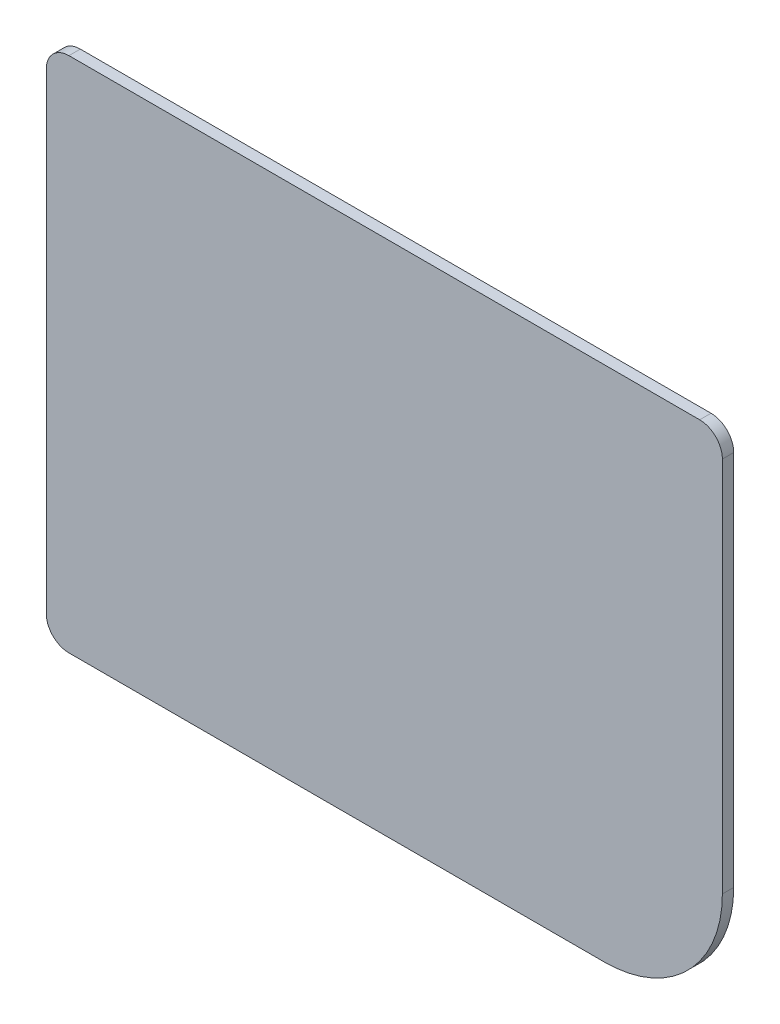
ISO-10303-21;
HEADER;
FILE_DESCRIPTION(('STEP AP214'),'2;1');
FILE_NAME('part.step','',(''),(''),'','','');
FILE_SCHEMA(('AUTOMOTIVE_DESIGN { 1 0 10303 214 1 1 1 1 }'));
ENDSEC;
DATA;
#1=APPLICATION_CONTEXT('core data for automotive mechanical design processes');
#2=APPLICATION_PROTOCOL_DEFINITION('international standard','automotive_design',2000,#1);
#3=PRODUCT_CONTEXT('',#1,'mechanical');
#4=PRODUCT('Part','Part','',(#3));
#5=PRODUCT_RELATED_PRODUCT_CATEGORY('part','',(#4));
#6=PRODUCT_DEFINITION_FORMATION('','',#4);
#7=PRODUCT_DEFINITION_CONTEXT('part definition',#1,'design');
#8=PRODUCT_DEFINITION('design','',#6,#7);
#9=PRODUCT_DEFINITION_SHAPE('','',#8);
#10=(LENGTH_UNIT() NAMED_UNIT(*) SI_UNIT(.MILLI.,.METRE.));
#11=(NAMED_UNIT(*) PLANE_ANGLE_UNIT() SI_UNIT($,.RADIAN.));
#12=(NAMED_UNIT(*) SI_UNIT($,.STERADIAN.) SOLID_ANGLE_UNIT());
#13=UNCERTAINTY_MEASURE_WITH_UNIT(LENGTH_MEASURE(1.E-05),#10,'distance_accuracy_value','');
#14=(GEOMETRIC_REPRESENTATION_CONTEXT(3) GLOBAL_UNCERTAINTY_ASSIGNED_CONTEXT((#13)) GLOBAL_UNIT_ASSIGNED_CONTEXT((#10,
#11,#12)) REPRESENTATION_CONTEXT('',''));
#15=CARTESIAN_POINT('',(0.,0.,0.));
#16=DIRECTION('',(0.,0.,1.));
#17=DIRECTION('',(1.,0.,0.));
#18=AXIS2_PLACEMENT_3D('',#15,#16,#17);
#19=CARTESIAN_POINT('',(24.25,-15.5,1.25));
#20=DIRECTION('',(0.,0.,-1.));
#21=DIRECTION('',(-1.,0.,0.));
#22=AXIS2_PLACEMENT_3D('',#19,#20,#21);
#23=CYLINDRICAL_SURFACE('',#22,13.);
#24=CARTESIAN_POINT('',(24.25,-15.5,0.));
#25=DIRECTION('',(0.,0.,1.));
#26=DIRECTION('',(1.,0.,0.));
#27=AXIS2_PLACEMENT_3D('',#24,#25,#26);
#28=CIRCLE('',#27,13.);
#29=CARTESIAN_POINT('',(24.2499999999999,-28.5,0.));
#30=VERTEX_POINT('',#29);
#31=CARTESIAN_POINT('',(37.25,-15.4999999999999,0.));
#32=VERTEX_POINT('',#31);
#33=EDGE_CURVE('E133',#30,#32,#28,.T.);
#34=ORIENTED_EDGE('',*,*,#33,.T.);
#35=DIRECTION('',(0.,0.,-1.));
#36=VECTOR('',#35,1.);
#37=CARTESIAN_POINT('',(37.25,-15.4999999999999,1.25));
#38=LINE('',#37,#36);
#39=CARTESIAN_POINT('',(37.25,-15.4999999999999,1.25));
#40=VERTEX_POINT('',#39);
#41=EDGE_CURVE('E11',#40,#32,#38,.T.);
#42=ORIENTED_EDGE('',*,*,#41,.F.);
#43=CARTESIAN_POINT('',(24.25,-15.5,1.25));
#44=DIRECTION('',(0.,0.,1.));
#45=DIRECTION('',(1.,0.,0.));
#46=AXIS2_PLACEMENT_3D('',#43,#44,#45);
#47=CIRCLE('',#46,13.);
#48=CARTESIAN_POINT('',(24.2499999999999,-28.5,1.25));
#49=VERTEX_POINT('',#48);
#50=EDGE_CURVE('E147',#49,#40,#47,.T.);
#51=ORIENTED_EDGE('',*,*,#50,.F.);
#52=DIRECTION('',(0.,0.,-1.));
#53=VECTOR('',#52,1.);
#54=CARTESIAN_POINT('',(24.2499999999999,-28.5,1.25));
#55=LINE('',#54,#53);
#56=EDGE_CURVE('E129',#49,#30,#55,.T.);
#57=ORIENTED_EDGE('',*,*,#56,.T.);
#58=EDGE_LOOP('',(#34,#42,#51,#57));
#59=FACE_BOUND('',#58,.T.);
#60=ADVANCED_FACE('F37',(#59),#23,.T.);
#61=CARTESIAN_POINT('',(37.25,-15.4999999999999,1.25));
#62=DIRECTION('',(-1.,0.,0.));
#63=DIRECTION('',(0.,0.,1.));
#64=AXIS2_PLACEMENT_3D('',#61,#62,#63);
#65=PLANE('',#64);
#66=DIRECTION('',(0.,1.,0.));
#67=VECTOR('',#66,1.);
#68=CARTESIAN_POINT('',(37.25,-15.4999999999999,0.));
#69=LINE('',#68,#67);
#70=CARTESIAN_POINT('',(37.25,26.,0.));
#71=VERTEX_POINT('',#70);
#72=EDGE_CURVE('E136',#32,#71,#69,.T.);
#73=ORIENTED_EDGE('',*,*,#72,.T.);
#74=DIRECTION('',(0.,0.,-1.));
#75=VECTOR('',#74,1.);
#76=CARTESIAN_POINT('',(37.25,26.,1.25));
#77=LINE('',#76,#75);
#78=CARTESIAN_POINT('',(37.25,26.,1.25));
#79=VERTEX_POINT('',#78);
#80=EDGE_CURVE('E45',#79,#71,#77,.T.);
#81=ORIENTED_EDGE('',*,*,#80,.F.);
#82=DIRECTION('',(0.,1.,0.));
#83=VECTOR('',#82,1.);
#84=CARTESIAN_POINT('',(37.25,-15.4999999999999,1.25));
#85=LINE('',#84,#83);
#86=EDGE_CURVE('E96',#40,#79,#85,.T.);
#87=ORIENTED_EDGE('',*,*,#86,.F.);
#88=ORIENTED_EDGE('',*,*,#41,.T.);
#89=EDGE_LOOP('',(#73,#81,#87,#88));
#90=FACE_BOUND('',#89,.T.);
#91=ADVANCED_FACE('F182',(#90),#65,.F.);
#92=CARTESIAN_POINT('',(34.75,26.,1.25));
#93=DIRECTION('',(0.,0.,-1.));
#94=DIRECTION('',(-1.,0.,0.));
#95=AXIS2_PLACEMENT_3D('',#92,#93,#94);
#96=CYLINDRICAL_SURFACE('',#95,2.5);
#97=CARTESIAN_POINT('',(34.75,26.,0.));
#98=DIRECTION('',(0.,0.,1.));
#99=DIRECTION('',(-1.,0.,0.));
#100=AXIS2_PLACEMENT_3D('',#97,#98,#99);
#101=CIRCLE('',#100,2.5);
#102=CARTESIAN_POINT('',(34.75,28.5,0.));
#103=VERTEX_POINT('',#102);
#104=EDGE_CURVE('E138',#71,#103,#101,.T.);
#105=ORIENTED_EDGE('',*,*,#104,.T.);
#106=DIRECTION('',(0.,0.,-1.));
#107=VECTOR('',#106,1.);
#108=CARTESIAN_POINT('',(34.75,28.5,1.25));
#109=LINE('',#108,#107);
#110=CARTESIAN_POINT('',(34.75,28.5,1.25));
#111=VERTEX_POINT('',#110);
#112=EDGE_CURVE('E154',#111,#103,#109,.T.);
#113=ORIENTED_EDGE('',*,*,#112,.F.);
#114=CARTESIAN_POINT('',(34.75,26.,1.25));
#115=DIRECTION('',(0.,0.,1.));
#116=DIRECTION('',(-1.,0.,0.));
#117=AXIS2_PLACEMENT_3D('',#114,#115,#116);
#118=CIRCLE('',#117,2.5);
#119=EDGE_CURVE('E162',#79,#111,#118,.T.);
#120=ORIENTED_EDGE('',*,*,#119,.F.);
#121=ORIENTED_EDGE('',*,*,#80,.T.);
#122=EDGE_LOOP('',(#105,#113,#120,#121));
#123=FACE_BOUND('',#122,.T.);
#124=ADVANCED_FACE('F160',(#123),#96,.T.);
#125=CARTESIAN_POINT('',(-34.75,28.5,1.25));
#126=DIRECTION('',(0.,-1.,0.));
#127=DIRECTION('',(0.,0.,-1.));
#128=AXIS2_PLACEMENT_3D('',#125,#126,#127);
#129=PLANE('',#128);
#130=DIRECTION('',(-1.,0.,0.));
#131=VECTOR('',#130,1.);
#132=CARTESIAN_POINT('',(-34.75,28.5,0.));
#133=LINE('',#132,#131);
#134=CARTESIAN_POINT('',(-34.75,28.5,0.));
#135=VERTEX_POINT('',#134);
#136=EDGE_CURVE('E140',#103,#135,#133,.T.);
#137=ORIENTED_EDGE('',*,*,#136,.T.);
#138=DIRECTION('',(0.,0.,-1.));
#139=VECTOR('',#138,1.);
#140=CARTESIAN_POINT('',(-34.75,28.5,1.25));
#141=LINE('',#140,#139);
#142=CARTESIAN_POINT('',(-34.75,28.5,1.25));
#143=VERTEX_POINT('',#142);
#144=EDGE_CURVE('E151',#143,#135,#141,.T.);
#145=ORIENTED_EDGE('',*,*,#144,.F.);
#146=DIRECTION('',(-1.,0.,0.));
#147=VECTOR('',#146,1.);
#148=CARTESIAN_POINT('',(-34.75,28.5,1.25));
#149=LINE('',#148,#147);
#150=EDGE_CURVE('E174',#111,#143,#149,.T.);
#151=ORIENTED_EDGE('',*,*,#150,.F.);
#152=ORIENTED_EDGE('',*,*,#112,.T.);
#153=EDGE_LOOP('',(#137,#145,#151,#152));
#154=FACE_BOUND('',#153,.T.);
#155=ADVANCED_FACE('F170',(#154),#129,.F.);
#156=CARTESIAN_POINT('',(-34.75,26.,1.25));
#157=DIRECTION('',(0.,0.,-1.));
#158=DIRECTION('',(-1.,0.,0.));
#159=AXIS2_PLACEMENT_3D('',#156,#157,#158);
#160=CYLINDRICAL_SURFACE('',#159,2.5);
#161=CARTESIAN_POINT('',(-34.75,26.,0.));
#162=DIRECTION('',(0.,0.,1.));
#163=DIRECTION('',(-1.,0.,0.));
#164=AXIS2_PLACEMENT_3D('',#161,#162,#163);
#165=CIRCLE('',#164,2.5);
#166=CARTESIAN_POINT('',(-37.25,26.,0.));
#167=VERTEX_POINT('',#166);
#168=EDGE_CURVE('E142',#135,#167,#165,.T.);
#169=ORIENTED_EDGE('',*,*,#168,.T.);
#170=DIRECTION('',(0.,0.,-1.));
#171=VECTOR('',#170,1.);
#172=CARTESIAN_POINT('',(-37.25,26.,1.25));
#173=LINE('',#172,#171);
#174=CARTESIAN_POINT('',(-37.25,26.,1.25));
#175=VERTEX_POINT('',#174);
#176=EDGE_CURVE('E124',#175,#167,#173,.T.);
#177=ORIENTED_EDGE('',*,*,#176,.F.);
#178=CARTESIAN_POINT('',(-34.75,26.,1.25));
#179=DIRECTION('',(0.,0.,1.));
#180=DIRECTION('',(-1.,0.,0.));
#181=AXIS2_PLACEMENT_3D('',#178,#179,#180);
#182=CIRCLE('',#181,2.5);
#183=EDGE_CURVE('E115',#143,#175,#182,.T.);
#184=ORIENTED_EDGE('',*,*,#183,.F.);
#185=ORIENTED_EDGE('',*,*,#144,.T.);
#186=EDGE_LOOP('',(#169,#177,#184,#185));
#187=FACE_BOUND('',#186,.T.);
#188=ADVANCED_FACE('F173',(#187),#160,.T.);
#189=CARTESIAN_POINT('',(-37.25,-26.,1.25));
#190=DIRECTION('',(1.,0.,0.));
#191=DIRECTION('',(0.,0.,-1.));
#192=AXIS2_PLACEMENT_3D('',#189,#190,#191);
#193=PLANE('',#192);
#194=DIRECTION('',(0.,-1.,0.));
#195=VECTOR('',#194,1.);
#196=CARTESIAN_POINT('',(-37.25,-26.,0.));
#197=LINE('',#196,#195);
#198=CARTESIAN_POINT('',(-37.25,-26.,0.));
#199=VERTEX_POINT('',#198);
#200=EDGE_CURVE('E123',#167,#199,#197,.T.);
#201=ORIENTED_EDGE('',*,*,#200,.T.);
#202=DIRECTION('',(0.,0.,-1.));
#203=VECTOR('',#202,1.);
#204=CARTESIAN_POINT('',(-37.25,-26.,1.25));
#205=LINE('',#204,#203);
#206=CARTESIAN_POINT('',(-37.25,-26.,1.25));
#207=VERTEX_POINT('',#206);
#208=EDGE_CURVE('E120',#207,#199,#205,.T.);
#209=ORIENTED_EDGE('',*,*,#208,.F.);
#210=DIRECTION('',(0.,-1.,0.));
#211=VECTOR('',#210,1.);
#212=CARTESIAN_POINT('',(-37.25,-26.,1.25));
#213=LINE('',#212,#211);
#214=EDGE_CURVE('E109',#175,#207,#213,.T.);
#215=ORIENTED_EDGE('',*,*,#214,.F.);
#216=ORIENTED_EDGE('',*,*,#176,.T.);
#217=EDGE_LOOP('',(#201,#209,#215,#216));
#218=FACE_BOUND('',#217,.T.);
#219=ADVANCED_FACE('F121',(#218),#193,.F.);
#220=CARTESIAN_POINT('',(-34.75,-26.,1.25));
#221=DIRECTION('',(0.,0.,-1.));
#222=DIRECTION('',(-1.,0.,0.));
#223=AXIS2_PLACEMENT_3D('',#220,#221,#222);
#224=CYLINDRICAL_SURFACE('',#223,2.5);
#225=CARTESIAN_POINT('',(-34.75,-26.,0.));
#226=DIRECTION('',(0.,0.,1.));
#227=DIRECTION('',(-1.,0.,0.));
#228=AXIS2_PLACEMENT_3D('',#225,#226,#227);
#229=CIRCLE('',#228,2.5);
#230=CARTESIAN_POINT('',(-34.75,-28.5,0.));
#231=VERTEX_POINT('',#230);
#232=EDGE_CURVE('E82',#199,#231,#229,.T.);
#233=ORIENTED_EDGE('',*,*,#232,.T.);
#234=DIRECTION('',(0.,0.,-1.));
#235=VECTOR('',#234,1.);
#236=CARTESIAN_POINT('',(-34.75,-28.5,1.25));
#237=LINE('',#236,#235);
#238=CARTESIAN_POINT('',(-34.75,-28.5,1.25));
#239=VERTEX_POINT('',#238);
#240=EDGE_CURVE('E125',#239,#231,#237,.T.);
#241=ORIENTED_EDGE('',*,*,#240,.F.);
#242=CARTESIAN_POINT('',(-34.75,-26.,1.25));
#243=DIRECTION('',(0.,0.,1.));
#244=DIRECTION('',(-1.,0.,0.));
#245=AXIS2_PLACEMENT_3D('',#242,#243,#244);
#246=CIRCLE('',#245,2.5);
#247=EDGE_CURVE('E113',#207,#239,#246,.T.);
#248=ORIENTED_EDGE('',*,*,#247,.F.);
#249=ORIENTED_EDGE('',*,*,#208,.T.);
#250=EDGE_LOOP('',(#233,#241,#248,#249));
#251=FACE_BOUND('',#250,.T.);
#252=ADVANCED_FACE('F127',(#251),#224,.T.);
#253=CARTESIAN_POINT('',(-34.75,-28.5,1.25));
#254=DIRECTION('',(0.,1.,0.));
#255=DIRECTION('',(0.,0.,1.));
#256=AXIS2_PLACEMENT_3D('',#253,#254,#255);
#257=PLANE('',#256);
#258=DIRECTION('',(1.,0.,0.));
#259=VECTOR('',#258,1.);
#260=CARTESIAN_POINT('',(-34.75,-28.5,0.));
#261=LINE('',#260,#259);
#262=EDGE_CURVE('E88',#231,#30,#261,.T.);
#263=ORIENTED_EDGE('',*,*,#262,.T.);
#264=ORIENTED_EDGE('',*,*,#56,.F.);
#265=DIRECTION('',(1.,0.,0.));
#266=VECTOR('',#265,1.);
#267=CARTESIAN_POINT('',(-34.75,-28.5,1.25));
#268=LINE('',#267,#266);
#269=EDGE_CURVE('E53',#239,#49,#268,.T.);
#270=ORIENTED_EDGE('',*,*,#269,.F.);
#271=ORIENTED_EDGE('',*,*,#240,.T.);
#272=EDGE_LOOP('',(#263,#264,#270,#271));
#273=FACE_BOUND('',#272,.T.);
#274=ADVANCED_FACE('F198',(#273),#257,.F.);
#275=CARTESIAN_POINT('',(24.25,-15.5,1.25));
#276=DIRECTION('',(0.,0.,1.));
#277=DIRECTION('',(1.,0.,0.));
#278=AXIS2_PLACEMENT_3D('',#275,#276,#277);
#279=PLANE('',#278);
#280=ORIENTED_EDGE('',*,*,#50,.T.);
#281=ORIENTED_EDGE('',*,*,#86,.T.);
#282=ORIENTED_EDGE('',*,*,#119,.T.);
#283=ORIENTED_EDGE('',*,*,#150,.T.);
#284=ORIENTED_EDGE('',*,*,#183,.T.);
#285=ORIENTED_EDGE('',*,*,#214,.T.);
#286=ORIENTED_EDGE('',*,*,#247,.T.);
#287=ORIENTED_EDGE('',*,*,#269,.T.);
#288=EDGE_LOOP('',(#280,#281,#282,#283,#284,#285,#286,#287));
#289=FACE_BOUND('',#288,.T.);
#290=ADVANCED_FACE('F111',(#289),#279,.T.);
#291=CARTESIAN_POINT('',(24.25,-15.5,0.));
#292=DIRECTION('',(0.,0.,1.));
#293=DIRECTION('',(1.,0.,0.));
#294=AXIS2_PLACEMENT_3D('',#291,#292,#293);
#295=PLANE('',#294);
#296=ORIENTED_EDGE('',*,*,#33,.F.);
#297=ORIENTED_EDGE('',*,*,#262,.F.);
#298=ORIENTED_EDGE('',*,*,#232,.F.);
#299=ORIENTED_EDGE('',*,*,#200,.F.);
#300=ORIENTED_EDGE('',*,*,#168,.F.);
#301=ORIENTED_EDGE('',*,*,#136,.F.);
#302=ORIENTED_EDGE('',*,*,#104,.F.);
#303=ORIENTED_EDGE('',*,*,#72,.F.);
#304=EDGE_LOOP('',(#296,#297,#298,#299,#300,#301,#302,#303));
#305=FACE_BOUND('',#304,.T.);
#306=ADVANCED_FACE('F166',(#305),#295,.F.);
#307=CLOSED_SHELL('',(#60,#91,#124,#155,#188,#219,#252,#274,#290,#306));
#308=MANIFOLD_SOLID_BREP('B2',#307);
#309=ADVANCED_BREP_SHAPE_REPRESENTATION('',(#18,#308),#14);
#310=SHAPE_DEFINITION_REPRESENTATION(#9,#309);
ENDSEC;
END-ISO-10303-21;
